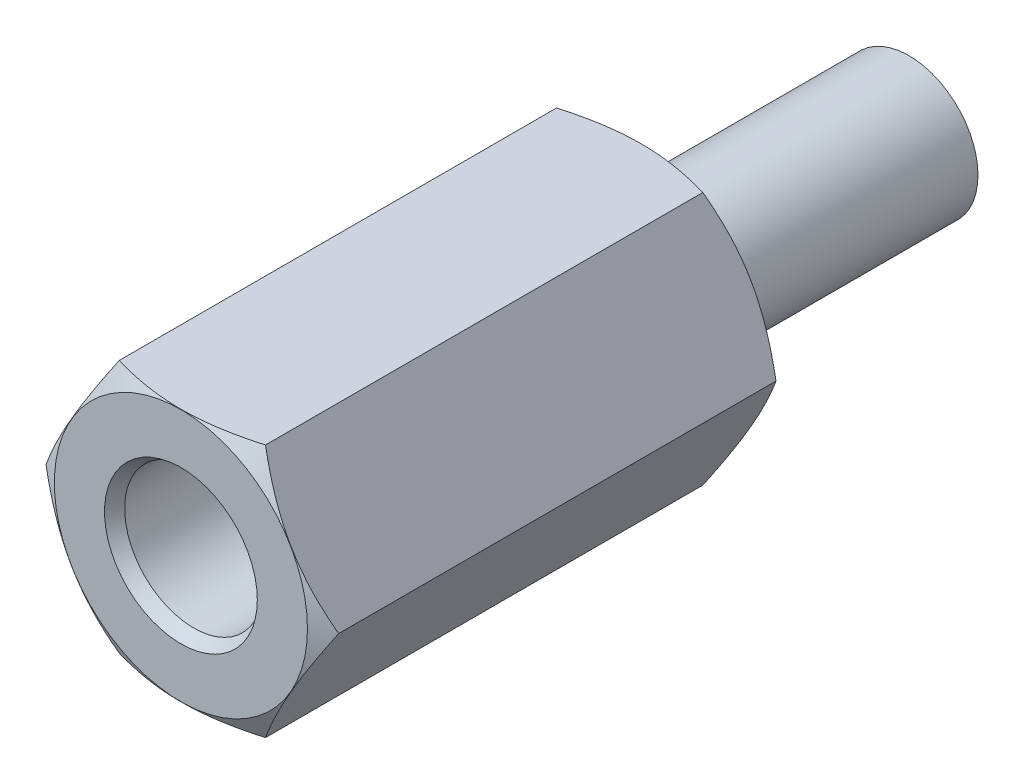
ISO-10303-21;
HEADER;
FILE_DESCRIPTION(('STEP AP214'),'2;1');
FILE_NAME('part.step','',(''),(''),'','','');
FILE_SCHEMA(('AUTOMOTIVE_DESIGN { 1 0 10303 214 1 1 1 1 }'));
ENDSEC;
DATA;
#1=APPLICATION_CONTEXT('core data for automotive mechanical design processes');
#2=APPLICATION_PROTOCOL_DEFINITION('international standard','automotive_design',2000,#1);
#3=PRODUCT_CONTEXT('',#1,'mechanical');
#4=PRODUCT('Part','Part','',(#3));
#5=PRODUCT_RELATED_PRODUCT_CATEGORY('part','',(#4));
#6=PRODUCT_DEFINITION_FORMATION('','',#4);
#7=PRODUCT_DEFINITION_CONTEXT('part definition',#1,'design');
#8=PRODUCT_DEFINITION('design','',#6,#7);
#9=PRODUCT_DEFINITION_SHAPE('','',#8);
#10=(LENGTH_UNIT() NAMED_UNIT(*) SI_UNIT(.MILLI.,.METRE.));
#11=(NAMED_UNIT(*) PLANE_ANGLE_UNIT() SI_UNIT($,.RADIAN.));
#12=(NAMED_UNIT(*) SI_UNIT($,.STERADIAN.) SOLID_ANGLE_UNIT());
#13=UNCERTAINTY_MEASURE_WITH_UNIT(LENGTH_MEASURE(1.E-05),#10,'distance_accuracy_value','');
#14=(GEOMETRIC_REPRESENTATION_CONTEXT(3) GLOBAL_UNCERTAINTY_ASSIGNED_CONTEXT((#13)) GLOBAL_UNIT_ASSIGNED_CONTEXT((#10,
#11,#12)) REPRESENTATION_CONTEXT('',''));
#15=CARTESIAN_POINT('',(0.,0.,0.));
#16=DIRECTION('',(0.,0.,1.));
#17=DIRECTION('',(1.,0.,0.));
#18=AXIS2_PLACEMENT_3D('',#15,#16,#17);
#19=CARTESIAN_POINT('',(3.18,0.,-10.));
#20=DIRECTION('',(-0.866025403784329,-0.50000000000019,0.));
#21=DIRECTION('',(-0.50000000000019,0.866025403784329,0.));
#22=AXIS2_PLACEMENT_3D('',#19,#20,#21);
#23=PLANE('',#22);
#24=DIRECTION('',(0.,0.,1.));
#25=VECTOR('',#24,1.);
#26=CARTESIAN_POINT('',(1.59,2.753960784035,-10.));
#27=LINE('',#26,#25);
#28=CARTESIAN_POINT('',(1.59,2.753960784034,0.248260615752));
#29=VERTEX_POINT('',#28);
#30=CARTESIAN_POINT('',(1.59,2.753960784034,9.751739384248));
#31=VERTEX_POINT('',#30);
#32=EDGE_CURVE('E11',#29,#31,#27,.T.);
#33=ORIENTED_EDGE('',*,*,#32,.T.);
#34=CARTESIAN_POINT('',(1.58999999999974,2.75396078403401,9.75173938424792));
#35=CARTESIAN_POINT('',(2.38499999999997,1.37698039201706,10.2107328482538));
#36=CARTESIAN_POINT('',(3.18000000000017,1.49213974509621E-13,9.75173938424797));
#37=(BOUNDED_CURVE() B_SPLINE_CURVE(2,(#34,#35,#36),.UNSPECIFIED.,.F.,
.F.) B_SPLINE_CURVE_WITH_KNOTS((3,3),(0.,1.),
.UNSPECIFIED.) CURVE() GEOMETRIC_REPRESENTATION_ITEM() RATIONAL_B_SPLINE_CURVE((1.,
1.15470053837927,1.)) REPRESENTATION_ITEM(''));
#38=CARTESIAN_POINT('',(3.18,0.,9.751739384248));
#39=VERTEX_POINT('',#38);
#40=EDGE_CURVE('E27',#31,#39,#37,.T.);
#41=ORIENTED_EDGE('',*,*,#40,.T.);
#42=DIRECTION('',(0.,0.,1.));
#43=VECTOR('',#42,1.);
#44=CARTESIAN_POINT('',(3.18,0.,0.248260615752));
#45=LINE('',#44,#43);
#46=CARTESIAN_POINT('',(3.18,0.,0.248260615752));
#47=VERTEX_POINT('',#46);
#48=EDGE_CURVE('E213',#47,#39,#45,.T.);
#49=ORIENTED_EDGE('',*,*,#48,.F.);
#50=CARTESIAN_POINT('',(3.18000000000026,0.,0.248260615752079));
#51=CARTESIAN_POINT('',(2.38500000000004,1.37698039201694,-0.210732848253774));
#52=CARTESIAN_POINT('',(1.58999999999983,2.75396078403385,0.248260615752026));
#53=(BOUNDED_CURVE() B_SPLINE_CURVE(2,(#50,#51,#52),.UNSPECIFIED.,.F.,
.F.) B_SPLINE_CURVE_WITH_KNOTS((3,3),(0.,1.),
.UNSPECIFIED.) CURVE() GEOMETRIC_REPRESENTATION_ITEM() RATIONAL_B_SPLINE_CURVE((1.,
1.15470053837928,1.)) REPRESENTATION_ITEM(''));
#54=EDGE_CURVE('E175',#47,#29,#53,.T.);
#55=ORIENTED_EDGE('',*,*,#54,.T.);
#56=EDGE_LOOP('',(#33,#41,#49,#55));
#57=FACE_BOUND('',#56,.T.);
#58=ADVANCED_FACE('F16',(#57),#23,.F.);
#59=CARTESIAN_POINT('',(0.,0.,0.));
#60=DIRECTION('',(0.,0.,1.));
#61=DIRECTION('',(1.,0.,0.));
#62=AXIS2_PLACEMENT_3D('',#59,#60,#61);
#63=CONICAL_SURFACE('',#62,2.75,1.047197551197);
#64=DIRECTION('',(0.866025403784329,0.,0.50000000000019));
#65=VECTOR('',#64,1.);
#66=CARTESIAN_POINT('',(2.75,0.,0.));
#67=LINE('',#66,#65);
#68=CARTESIAN_POINT('',(2.75,0.,0.));
#69=VERTEX_POINT('',#68);
#70=EDGE_CURVE('E255',#69,#47,#67,.T.);
#71=ORIENTED_EDGE('',*,*,#70,.F.);
#72=CARTESIAN_POINT('',(0.,0.,0.));
#73=DIRECTION('',(0.,0.,1.));
#74=DIRECTION('',(1.,0.,0.));
#75=AXIS2_PLACEMENT_3D('',#72,#73,#74);
#76=CIRCLE('',#75,2.75);
#77=EDGE_CURVE('E183',#69,#69,#76,.T.);
#78=ORIENTED_EDGE('',*,*,#77,.T.);
#79=ORIENTED_EDGE('',*,*,#70,.T.);
#80=CARTESIAN_POINT('',(1.58999999999974,-2.75396078403401,0.248260615752079));
#81=CARTESIAN_POINT('',(2.38499999999996,-1.37698039201706,-0.210732848253774));
#82=CARTESIAN_POINT('',(3.18000000000017,-1.49213974509621E-13,0.248260615752026));
#83=(BOUNDED_CURVE() B_SPLINE_CURVE(2,(#80,#81,#82),.UNSPECIFIED.,.F.,
.F.) B_SPLINE_CURVE_WITH_KNOTS((3,3),(0.,1.),
.UNSPECIFIED.) CURVE() GEOMETRIC_REPRESENTATION_ITEM() RATIONAL_B_SPLINE_CURVE((1.,
1.15470053837928,1.)) REPRESENTATION_ITEM(''));
#84=CARTESIAN_POINT('',(1.59,-2.753960784034,0.248260615752));
#85=VERTEX_POINT('',#84);
#86=EDGE_CURVE('E148',#85,#47,#83,.T.);
#87=ORIENTED_EDGE('',*,*,#86,.F.);
#88=CARTESIAN_POINT('',(-1.58999999999975,-2.753960784035,0.248260615751858));
#89=CARTESIAN_POINT('',(1.22568621918617E-13,-2.75396078403501,-0.210732848253664));
#90=CARTESIAN_POINT('',(1.59000000000008,-2.753960784035,0.248260615751953));
#91=(BOUNDED_CURVE() B_SPLINE_CURVE(2,(#88,#89,#90),.UNSPECIFIED.,.F.,
.F.) B_SPLINE_CURVE_WITH_KNOTS((3,3),(0.,1.),
.UNSPECIFIED.) CURVE() GEOMETRIC_REPRESENTATION_ITEM() RATIONAL_B_SPLINE_CURVE((1.,
1.15470053837918,1.)) REPRESENTATION_ITEM(''));
#92=CARTESIAN_POINT('',(-1.59,-2.753960784035,0.248260615752));
#93=VERTEX_POINT('',#92);
#94=EDGE_CURVE('E81',#93,#85,#91,.T.);
#95=ORIENTED_EDGE('',*,*,#94,.F.);
#96=CARTESIAN_POINT('',(-3.18000000000019,-1.10578213252666E-13,0.248260615752039));
#97=CARTESIAN_POINT('',(-2.3849999999999,-1.37698039201718,-0.210732848253821));
#98=CARTESIAN_POINT('',(-1.58999999999955,-2.75396078403435,0.248260615752193));
#99=(BOUNDED_CURVE() B_SPLINE_CURVE(2,(#96,#97,#98),.UNSPECIFIED.,.F.,
.F.) B_SPLINE_CURVE_WITH_KNOTS((3,3),(0.,1.),
.UNSPECIFIED.) CURVE() GEOMETRIC_REPRESENTATION_ITEM() RATIONAL_B_SPLINE_CURVE((1.,
1.15470053837932,1.)) REPRESENTATION_ITEM(''));
#100=CARTESIAN_POINT('',(-3.18,0.,0.248260615752));
#101=VERTEX_POINT('',#100);
#102=EDGE_CURVE('E154',#101,#93,#99,.T.);
#103=ORIENTED_EDGE('',*,*,#102,.F.);
#104=CARTESIAN_POINT('',(-1.58999999999887,2.75396078403551,0.248260615752579));
#105=CARTESIAN_POINT('',(-2.38499999999965,1.37698039201761,-0.210732848253967));
#106=CARTESIAN_POINT('',(-3.18000000000019,1.0946799022804E-13,0.24826061575204));
#107=(BOUNDED_CURVE() B_SPLINE_CURVE(2,(#104,#105,#106),.UNSPECIFIED.,.F.,
.F.) B_SPLINE_CURVE_WITH_KNOTS((3,3),(0.,1.),
.UNSPECIFIED.) CURVE() GEOMETRIC_REPRESENTATION_ITEM() RATIONAL_B_SPLINE_CURVE((1.,
1.15470053837944,1.)) REPRESENTATION_ITEM(''));
#108=CARTESIAN_POINT('',(-1.59,2.753960784035,0.248260615752));
#109=VERTEX_POINT('',#108);
#110=EDGE_CURVE('E202',#109,#101,#107,.T.);
#111=ORIENTED_EDGE('',*,*,#110,.F.);
#112=CARTESIAN_POINT('',(1.58999999999975,2.753960784035,0.248260615751858));
#113=CARTESIAN_POINT('',(-1.22124532708767E-13,2.75396078403501,-0.210732848253664));
#114=CARTESIAN_POINT('',(-1.59000000000008,2.753960784035,0.248260615751953));
#115=(BOUNDED_CURVE() B_SPLINE_CURVE(2,(#112,#113,#114),.UNSPECIFIED.,.F.,
.F.) B_SPLINE_CURVE_WITH_KNOTS((3,3),(0.,1.),
.UNSPECIFIED.) CURVE() GEOMETRIC_REPRESENTATION_ITEM() RATIONAL_B_SPLINE_CURVE((1.,
1.15470053837918,1.)) REPRESENTATION_ITEM(''));
#116=EDGE_CURVE('E174',#29,#109,#115,.T.);
#117=ORIENTED_EDGE('',*,*,#116,.F.);
#118=ORIENTED_EDGE('',*,*,#54,.F.);
#119=EDGE_LOOP('',(#71,#78,#79,#87,#95,#103,#111,#117,#118));
#120=FACE_BOUND('',#119,.T.);
#121=ADVANCED_FACE('F324',(#120),#63,.T.);
#122=CARTESIAN_POINT('',(1.59,2.753960784035,-10.));
#123=DIRECTION('',(0.,-1.,0.));
#124=DIRECTION('',(-1.,0.,0.));
#125=AXIS2_PLACEMENT_3D('',#122,#123,#124);
#126=PLANE('',#125);
#127=DIRECTION('',(0.,0.,1.));
#128=VECTOR('',#127,1.);
#129=CARTESIAN_POINT('',(-1.59,2.753960784035,-10.));
#130=LINE('',#129,#128);
#131=CARTESIAN_POINT('',(-1.59,2.753960784035,9.751739384248));
#132=VERTEX_POINT('',#131);
#133=EDGE_CURVE('E173',#109,#132,#130,.T.);
#134=ORIENTED_EDGE('',*,*,#133,.T.);
#135=CARTESIAN_POINT('',(-1.58999999999975,2.753960784035,9.75173938424814));
#136=CARTESIAN_POINT('',(1.23456800338317E-13,2.753960784035,10.2107328482537));
#137=CARTESIAN_POINT('',(1.59000000000009,2.753960784035,9.75173938424805));
#138=(BOUNDED_CURVE() B_SPLINE_CURVE(2,(#135,#136,#137),.UNSPECIFIED.,.F.,
.F.) B_SPLINE_CURVE_WITH_KNOTS((3,3),(0.,1.),
.UNSPECIFIED.) CURVE() GEOMETRIC_REPRESENTATION_ITEM() RATIONAL_B_SPLINE_CURVE((1.,
1.15470053837918,1.)) REPRESENTATION_ITEM(''));
#139=EDGE_CURVE('E167',#132,#31,#138,.T.);
#140=ORIENTED_EDGE('',*,*,#139,.T.);
#141=ORIENTED_EDGE('',*,*,#32,.F.);
#142=ORIENTED_EDGE('',*,*,#116,.T.);
#143=EDGE_LOOP('',(#134,#140,#141,#142));
#144=FACE_BOUND('',#143,.T.);
#145=ADVANCED_FACE('F318',(#144),#126,.F.);
#146=CARTESIAN_POINT('',(0.,0.,9.751739384248));
#147=DIRECTION('',(0.,0.,-1.));
#148=DIRECTION('',(1.,0.,0.));
#149=AXIS2_PLACEMENT_3D('',#146,#147,#148);
#150=CONICAL_SURFACE('',#149,3.18,1.047197551197);
#151=CARTESIAN_POINT('',(3.18000000000026,0.,9.75173938424792));
#152=CARTESIAN_POINT('',(2.38500000000003,-1.37698039201694,10.2107328482538));
#153=CARTESIAN_POINT('',(1.58999999999983,-2.75396078403385,9.75173938424797));
#154=(BOUNDED_CURVE() B_SPLINE_CURVE(2,(#151,#152,#153),.UNSPECIFIED.,.F.,
.F.) B_SPLINE_CURVE_WITH_KNOTS((3,3),(0.,1.),
.UNSPECIFIED.) CURVE() GEOMETRIC_REPRESENTATION_ITEM() RATIONAL_B_SPLINE_CURVE((1.,
1.15470053837928,1.)) REPRESENTATION_ITEM(''));
#155=CARTESIAN_POINT('',(1.59,-2.753960784034,9.751739384248));
#156=VERTEX_POINT('',#155);
#157=EDGE_CURVE('E207',#39,#156,#154,.T.);
#158=ORIENTED_EDGE('',*,*,#157,.F.);
#159=DIRECTION('',(-0.866025403784329,0.,0.50000000000019));
#160=VECTOR('',#159,1.);
#161=CARTESIAN_POINT('',(3.18,0.,9.751739384248));
#162=LINE('',#161,#160);
#163=CARTESIAN_POINT('',(2.75,0.,10.));
#164=VERTEX_POINT('',#163);
#165=EDGE_CURVE('E192',#39,#164,#162,.T.);
#166=ORIENTED_EDGE('',*,*,#165,.T.);
#167=CARTESIAN_POINT('',(0.,0.,10.));
#168=DIRECTION('',(0.,0.,1.));
#169=DIRECTION('',(1.,0.,0.));
#170=AXIS2_PLACEMENT_3D('',#167,#168,#169);
#171=CIRCLE('',#170,2.75);
#172=EDGE_CURVE('E160',#164,#164,#171,.T.);
#173=ORIENTED_EDGE('',*,*,#172,.F.);
#174=ORIENTED_EDGE('',*,*,#165,.F.);
#175=ORIENTED_EDGE('',*,*,#40,.F.);
#176=ORIENTED_EDGE('',*,*,#139,.F.);
#177=CARTESIAN_POINT('',(-3.18000000000019,1.17905685215192E-13,9.75173938424796));
#178=CARTESIAN_POINT('',(-2.3849999999999,1.37698039201718,10.2107328482538));
#179=CARTESIAN_POINT('',(-1.58999999999955,2.75396078403435,9.75173938424781));
#180=(BOUNDED_CURVE() B_SPLINE_CURVE(2,(#177,#178,#179),.UNSPECIFIED.,.F.,
.F.) B_SPLINE_CURVE_WITH_KNOTS((3,3),(0.,1.),
.UNSPECIFIED.) CURVE() GEOMETRIC_REPRESENTATION_ITEM() RATIONAL_B_SPLINE_CURVE((1.,
1.15470053837932,1.)) REPRESENTATION_ITEM(''));
#181=CARTESIAN_POINT('',(-3.18,0.,9.751739384248));
#182=VERTEX_POINT('',#181);
#183=EDGE_CURVE('E193',#182,#132,#180,.T.);
#184=ORIENTED_EDGE('',*,*,#183,.F.);
#185=CARTESIAN_POINT('',(-1.58999999999887,-2.75396078403551,9.75173938424742));
#186=CARTESIAN_POINT('',(-2.38499999999965,-1.3769803920176,10.210732848254));
#187=CARTESIAN_POINT('',(-3.18000000000019,-1.07469588783715E-13,9.75173938424796));
#188=(BOUNDED_CURVE() B_SPLINE_CURVE(2,(#185,#186,#187),.UNSPECIFIED.,.F.,
.F.) B_SPLINE_CURVE_WITH_KNOTS((3,3),(0.,1.),
.UNSPECIFIED.) CURVE() GEOMETRIC_REPRESENTATION_ITEM() RATIONAL_B_SPLINE_CURVE((1.,
1.15470053837944,1.)) REPRESENTATION_ITEM(''));
#189=CARTESIAN_POINT('',(-1.59,-2.753960784035,9.751739384248));
#190=VERTEX_POINT('',#189);
#191=EDGE_CURVE('E214',#190,#182,#188,.T.);
#192=ORIENTED_EDGE('',*,*,#191,.F.);
#193=CARTESIAN_POINT('',(1.58999999999975,-2.753960784035,9.75173938424814));
#194=CARTESIAN_POINT('',(-1.22568621918617E-13,-2.753960784035,10.2107328482537));
#195=CARTESIAN_POINT('',(-1.59000000000009,-2.753960784035,9.75173938424805));
#196=(BOUNDED_CURVE() B_SPLINE_CURVE(2,(#193,#194,#195),.UNSPECIFIED.,.F.,
.F.) B_SPLINE_CURVE_WITH_KNOTS((3,3),(0.,1.),
.UNSPECIFIED.) CURVE() GEOMETRIC_REPRESENTATION_ITEM() RATIONAL_B_SPLINE_CURVE((1.,
1.15470053837918,1.)) REPRESENTATION_ITEM(''));
#197=EDGE_CURVE('E155',#156,#190,#196,.T.);
#198=ORIENTED_EDGE('',*,*,#197,.F.);
#199=EDGE_LOOP('',(#158,#166,#173,#174,#175,#176,#184,#192,#198));
#200=FACE_BOUND('',#199,.T.);
#201=ADVANCED_FACE('F285',(#200),#150,.T.);
#202=CARTESIAN_POINT('',(1.59,-2.753960784035,-10.));
#203=DIRECTION('',(-0.866025403784329,0.50000000000019,0.));
#204=DIRECTION('',(0.,0.,1.));
#205=AXIS2_PLACEMENT_3D('',#202,#203,#204);
#206=PLANE('',#205);
#207=ORIENTED_EDGE('',*,*,#48,.T.);
#208=ORIENTED_EDGE('',*,*,#157,.T.);
#209=DIRECTION('',(0.,0.,1.));
#210=VECTOR('',#209,1.);
#211=CARTESIAN_POINT('',(1.59,-2.753960784035,-10.));
#212=LINE('',#211,#210);
#213=EDGE_CURVE('E152',#85,#156,#212,.T.);
#214=ORIENTED_EDGE('',*,*,#213,.F.);
#215=ORIENTED_EDGE('',*,*,#86,.T.);
#216=EDGE_LOOP('',(#207,#208,#214,#215));
#217=FACE_BOUND('',#216,.T.);
#218=ADVANCED_FACE('F386',(#217),#206,.F.);
#219=CARTESIAN_POINT('',(-1.59,2.753960784035,-10.));
#220=DIRECTION('',(0.866025403784329,-0.50000000000019,0.));
#221=DIRECTION('',(0.,0.,-1.));
#222=AXIS2_PLACEMENT_3D('',#219,#220,#221);
#223=PLANE('',#222);
#224=DIRECTION('',(0.,0.,1.));
#225=VECTOR('',#224,1.);
#226=CARTESIAN_POINT('',(-3.18,0.,-10.));
#227=LINE('',#226,#225);
#228=EDGE_CURVE('E201',#101,#182,#227,.T.);
#229=ORIENTED_EDGE('',*,*,#228,.T.);
#230=ORIENTED_EDGE('',*,*,#183,.T.);
#231=ORIENTED_EDGE('',*,*,#133,.F.);
#232=ORIENTED_EDGE('',*,*,#110,.T.);
#233=EDGE_LOOP('',(#229,#230,#231,#232));
#234=FACE_BOUND('',#233,.T.);
#235=ADVANCED_FACE('F341',(#234),#223,.F.);
#236=CARTESIAN_POINT('',(-3.18,0.,-10.));
#237=DIRECTION('',(0.866025403784329,0.50000000000019,0.));
#238=DIRECTION('',(0.,0.,-1.));
#239=AXIS2_PLACEMENT_3D('',#236,#237,#238);
#240=PLANE('',#239);
#241=DIRECTION('',(0.,0.,1.));
#242=VECTOR('',#241,1.);
#243=CARTESIAN_POINT('',(-1.59,-2.753960784035,-10.));
#244=LINE('',#243,#242);
#245=EDGE_CURVE('E222',#93,#190,#244,.T.);
#246=ORIENTED_EDGE('',*,*,#245,.T.);
#247=ORIENTED_EDGE('',*,*,#191,.T.);
#248=ORIENTED_EDGE('',*,*,#228,.F.);
#249=ORIENTED_EDGE('',*,*,#102,.T.);
#250=EDGE_LOOP('',(#246,#247,#248,#249));
#251=FACE_BOUND('',#250,.T.);
#252=ADVANCED_FACE('F335',(#251),#240,.F.);
#253=CARTESIAN_POINT('',(-1.59,-2.753960784035,-10.));
#254=DIRECTION('',(0.,1.,0.));
#255=DIRECTION('',(1.,0.,0.));
#256=AXIS2_PLACEMENT_3D('',#253,#254,#255);
#257=PLANE('',#256);
#258=ORIENTED_EDGE('',*,*,#213,.T.);
#259=ORIENTED_EDGE('',*,*,#197,.T.);
#260=ORIENTED_EDGE('',*,*,#245,.F.);
#261=ORIENTED_EDGE('',*,*,#94,.T.);
#262=EDGE_LOOP('',(#258,#259,#260,#261));
#263=FACE_BOUND('',#262,.T.);
#264=ADVANCED_FACE('F340',(#263),#257,.F.);
#265=CARTESIAN_POINT('',(0.,0.,0.));
#266=DIRECTION('',(0.,0.,1.));
#267=DIRECTION('',(1.,0.,0.));
#268=AXIS2_PLACEMENT_3D('',#265,#266,#267);
#269=PLANE('',#268);
#270=CARTESIAN_POINT('',(0.,0.,0.));
#271=DIRECTION('',(0.,0.,1.));
#272=DIRECTION('',(1.,0.,0.));
#273=AXIS2_PLACEMENT_3D('',#270,#271,#272);
#274=CIRCLE('',#273,1.5);
#275=CARTESIAN_POINT('',(1.5,0.,0.));
#276=VERTEX_POINT('',#275);
#277=EDGE_CURVE('E237',#276,#276,#274,.T.);
#278=ORIENTED_EDGE('',*,*,#277,.T.);
#279=EDGE_LOOP('',(#278));
#280=FACE_BOUND('',#279,.T.);
#281=ORIENTED_EDGE('',*,*,#77,.F.);
#282=EDGE_LOOP('',(#281));
#283=FACE_BOUND('',#282,.T.);
#284=ADVANCED_FACE('F403',(#280,#283),#269,.F.);
#285=CARTESIAN_POINT('',(0.,0.,10.));
#286=DIRECTION('',(0.,0.,1.));
#287=DIRECTION('',(1.,0.,0.));
#288=AXIS2_PLACEMENT_3D('',#285,#286,#287);
#289=PLANE('',#288);
#290=ORIENTED_EDGE('',*,*,#172,.T.);
#291=EDGE_LOOP('',(#290));
#292=FACE_BOUND('',#291,.T.);
#293=CARTESIAN_POINT('',(0.,0.,10.));
#294=DIRECTION('',(0.,0.,1.));
#295=DIRECTION('',(1.,0.,0.));
#296=AXIS2_PLACEMENT_3D('',#293,#294,#295);
#297=CIRCLE('',#296,1.66);
#298=CARTESIAN_POINT('',(1.66,0.,10.));
#299=VERTEX_POINT('',#298);
#300=EDGE_CURVE('E265',#299,#299,#297,.T.);
#301=ORIENTED_EDGE('',*,*,#300,.F.);
#302=EDGE_LOOP('',(#301));
#303=FACE_BOUND('',#302,.T.);
#304=ADVANCED_FACE('F288',(#292,#303),#289,.T.);
#305=CARTESIAN_POINT('',(0.,0.,-5.821021416551));
#306=DIRECTION('',(0.,0.,1.));
#307=DIRECTION('',(1.,0.,0.));
#308=AXIS2_PLACEMENT_3D('',#305,#306,#307);
#309=CYLINDRICAL_SURFACE('',#308,1.5);
#310=CARTESIAN_POINT('',(0.,0.,-5.821021416551));
#311=DIRECTION('',(0.,0.,1.));
#312=DIRECTION('',(1.,0.,0.));
#313=AXIS2_PLACEMENT_3D('',#310,#311,#312);
#314=CIRCLE('',#313,1.5);
#315=CARTESIAN_POINT('',(1.5,0.,-5.821021416551));
#316=VERTEX_POINT('',#315);
#317=EDGE_CURVE('E156',#316,#316,#314,.T.);
#318=ORIENTED_EDGE('',*,*,#317,.T.);
#319=DIRECTION('',(0.,0.,1.));
#320=VECTOR('',#319,1.);
#321=CARTESIAN_POINT('',(1.5,0.,-5.821021416551));
#322=LINE('',#321,#320);
#323=EDGE_CURVE('E161',#316,#276,#322,.T.);
#324=ORIENTED_EDGE('',*,*,#323,.T.);
#325=ORIENTED_EDGE('',*,*,#277,.F.);
#326=ORIENTED_EDGE('',*,*,#323,.F.);
#327=EDGE_LOOP('',(#318,#324,#325,#326));
#328=FACE_BOUND('',#327,.T.);
#329=ADVANCED_FACE('F451',(#328),#309,.T.);
#330=CARTESIAN_POINT('',(0.,0.,10.));
#331=DIRECTION('',(0.,0.,1.));
#332=DIRECTION('',(1.,0.,0.));
#333=AXIS2_PLACEMENT_3D('',#330,#331,#332);
#334=CONICAL_SURFACE('',#333,1.66,0.523598775598);
#335=ORIENTED_EDGE('',*,*,#300,.T.);
#336=DIRECTION('',(-0.50000000000019,0.,-0.866025403784329));
#337=VECTOR('',#336,1.);
#338=CARTESIAN_POINT('',(1.66,0.,10.));
#339=LINE('',#338,#337);
#340=CARTESIAN_POINT('',(1.5,0.,9.722871870789));
#341=VERTEX_POINT('',#340);
#342=EDGE_CURVE('E20',#299,#341,#339,.T.);
#343=ORIENTED_EDGE('',*,*,#342,.T.);
#344=CARTESIAN_POINT('',(0.,0.,9.722871870789));
#345=DIRECTION('',(0.,0.,1.));
#346=DIRECTION('',(1.,0.,0.));
#347=AXIS2_PLACEMENT_3D('',#344,#345,#346);
#348=CIRCLE('',#347,1.5);
#349=EDGE_CURVE('E142',#341,#341,#348,.T.);
#350=ORIENTED_EDGE('',*,*,#349,.F.);
#351=ORIENTED_EDGE('',*,*,#342,.F.);
#352=EDGE_LOOP('',(#335,#343,#350,#351));
#353=FACE_BOUND('',#352,.T.);
#354=ADVANCED_FACE('F313',(#353),#334,.F.);
#355=CARTESIAN_POINT('',(0.,0.,-6.));
#356=DIRECTION('',(0.,0.,1.));
#357=DIRECTION('',(1.,0.,0.));
#358=AXIS2_PLACEMENT_3D('',#355,#356,#357);
#359=CONICAL_SURFACE('',#358,1.19,1.047197551197);
#360=CARTESIAN_POINT('',(0.,0.,-6.));
#361=DIRECTION('',(0.,0.,1.));
#362=DIRECTION('',(1.,0.,0.));
#363=AXIS2_PLACEMENT_3D('',#360,#361,#362);
#364=CIRCLE('',#363,1.19);
#365=CARTESIAN_POINT('',(1.19,0.,-6.));
#366=VERTEX_POINT('',#365);
#367=EDGE_CURVE('E162',#366,#366,#364,.T.);
#368=ORIENTED_EDGE('',*,*,#367,.T.);
#369=DIRECTION('',(0.866025403784329,0.,0.50000000000019));
#370=VECTOR('',#369,1.);
#371=CARTESIAN_POINT('',(1.19,0.,-6.));
#372=LINE('',#371,#370);
#373=EDGE_CURVE('E166',#366,#316,#372,.T.);
#374=ORIENTED_EDGE('',*,*,#373,.T.);
#375=ORIENTED_EDGE('',*,*,#317,.F.);
#376=ORIENTED_EDGE('',*,*,#373,.F.);
#377=EDGE_LOOP('',(#368,#374,#375,#376));
#378=FACE_BOUND('',#377,.T.);
#379=ADVANCED_FACE('F350',(#378),#359,.T.);
#380=CARTESIAN_POINT('',(0.,0.,9.722871870789));
#381=DIRECTION('',(0.,0.,-1.));
#382=DIRECTION('',(1.,0.,0.));
#383=AXIS2_PLACEMENT_3D('',#380,#381,#382);
#384=CYLINDRICAL_SURFACE('',#383,1.5);
#385=ORIENTED_EDGE('',*,*,#349,.T.);
#386=DIRECTION('',(0.,0.,-1.));
#387=VECTOR('',#386,1.);
#388=CARTESIAN_POINT('',(1.5,0.,9.722871870789));
#389=LINE('',#388,#387);
#390=CARTESIAN_POINT('',(1.5,0.,4.));
#391=VERTEX_POINT('',#390);
#392=EDGE_CURVE('E135',#341,#391,#389,.T.);
#393=ORIENTED_EDGE('',*,*,#392,.T.);
#394=CARTESIAN_POINT('',(0.,0.,4.));
#395=DIRECTION('',(0.,0.,1.));
#396=DIRECTION('',(1.,0.,0.));
#397=AXIS2_PLACEMENT_3D('',#394,#395,#396);
#398=CIRCLE('',#397,1.5);
#399=EDGE_CURVE('E132',#391,#391,#398,.T.);
#400=ORIENTED_EDGE('',*,*,#399,.F.);
#401=ORIENTED_EDGE('',*,*,#392,.F.);
#402=EDGE_LOOP('',(#385,#393,#400,#401));
#403=FACE_BOUND('',#402,.T.);
#404=ADVANCED_FACE('F134',(#403),#384,.F.);
#405=CARTESIAN_POINT('',(0.,0.,-6.));
#406=DIRECTION('',(0.,0.,1.));
#407=DIRECTION('',(1.,0.,0.));
#408=AXIS2_PLACEMENT_3D('',#405,#406,#407);
#409=PLANE('',#408);
#410=ORIENTED_EDGE('',*,*,#367,.F.);
#411=EDGE_LOOP('',(#410));
#412=FACE_BOUND('',#411,.T.);
#413=ADVANCED_FACE('F366',(#412),#409,.F.);
#414=CARTESIAN_POINT('',(0.,0.,4.));
#415=DIRECTION('',(0.,0.,1.));
#416=DIRECTION('',(1.,0.,0.));
#417=AXIS2_PLACEMENT_3D('',#414,#415,#416);
#418=CONICAL_SURFACE('',#417,1.5,1.047197551197);
#419=ORIENTED_EDGE('',*,*,#399,.T.);
#420=DIRECTION('',(-0.866025403784329,0.,-0.50000000000019));
#421=VECTOR('',#420,1.);
#422=CARTESIAN_POINT('',(1.5,0.,4.));
#423=LINE('',#422,#421);
#424=CARTESIAN_POINT('',(0.,0.,3.133974596216));
#425=VERTEX_POINT('',#424);
#426=EDGE_CURVE('E126',#391,#425,#423,.T.);
#427=ORIENTED_EDGE('',*,*,#426,.T.);
#428=ORIENTED_EDGE('',*,*,#426,.F.);
#429=EDGE_LOOP('',(#419,#427,#428));
#430=FACE_BOUND('',#429,.T.);
#431=ADVANCED_FACE('F18',(#430),#418,.F.);
#432=CLOSED_SHELL('',(#58,#121,#145,#201,#218,#235,#252,#264,#284,#304,#329,#354,#379,#404,#413,#431));
#433=MANIFOLD_SOLID_BREP('B1',#432);
#434=ADVANCED_BREP_SHAPE_REPRESENTATION('',(#18,#433),#14);
#435=SHAPE_DEFINITION_REPRESENTATION(#9,#434);
ENDSEC;
END-ISO-10303-21;
